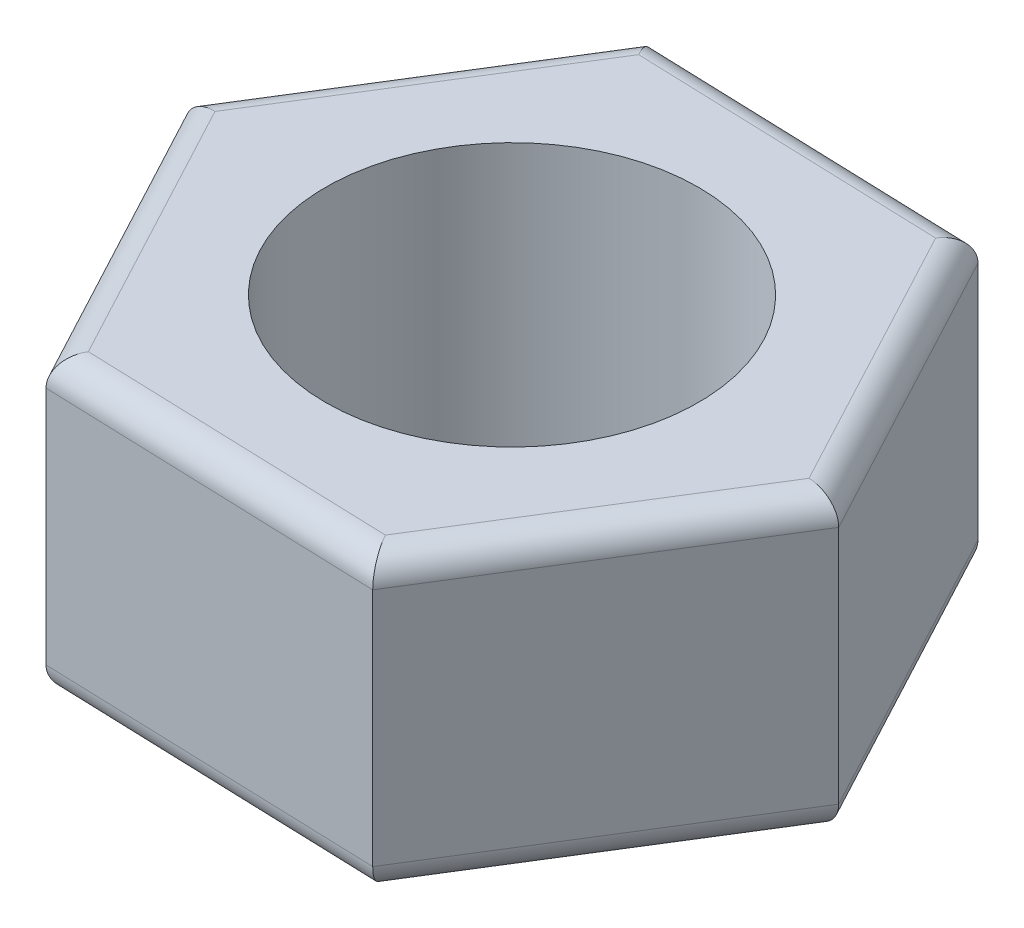
ISO-10303-21;
HEADER;
FILE_DESCRIPTION(('STEP AP214'),'2;1');
FILE_NAME('part.step','',(''),(''),'','','');
FILE_SCHEMA(('AUTOMOTIVE_DESIGN { 1 0 10303 214 1 1 1 1 }'));
ENDSEC;
DATA;
#1=APPLICATION_CONTEXT('core data for automotive mechanical design processes');
#2=APPLICATION_PROTOCOL_DEFINITION('international standard','automotive_design',2000,#1);
#3=PRODUCT_CONTEXT('',#1,'mechanical');
#4=PRODUCT('Part','Part','',(#3));
#5=PRODUCT_RELATED_PRODUCT_CATEGORY('part','',(#4));
#6=PRODUCT_DEFINITION_FORMATION('','',#4);
#7=PRODUCT_DEFINITION_CONTEXT('part definition',#1,'design');
#8=PRODUCT_DEFINITION('design','',#6,#7);
#9=PRODUCT_DEFINITION_SHAPE('','',#8);
#10=(LENGTH_UNIT() NAMED_UNIT(*) SI_UNIT(.MILLI.,.METRE.));
#11=(NAMED_UNIT(*) PLANE_ANGLE_UNIT() SI_UNIT($,.RADIAN.));
#12=(NAMED_UNIT(*) SI_UNIT($,.STERADIAN.) SOLID_ANGLE_UNIT());
#13=UNCERTAINTY_MEASURE_WITH_UNIT(LENGTH_MEASURE(1.E-05),#10,'distance_accuracy_value','');
#14=(GEOMETRIC_REPRESENTATION_CONTEXT(3) GLOBAL_UNCERTAINTY_ASSIGNED_CONTEXT((#13)) GLOBAL_UNIT_ASSIGNED_CONTEXT((#10,
#11,#12)) REPRESENTATION_CONTEXT('',''));
#15=CARTESIAN_POINT('',(0.,0.,0.));
#16=DIRECTION('',(0.,0.,1.));
#17=DIRECTION('',(1.,0.,0.));
#18=AXIS2_PLACEMENT_3D('',#15,#16,#17);
#19=CARTESIAN_POINT('',(0.,11.,0.));
#20=DIRECTION('',(0.,1.,0.));
#21=DIRECTION('',(0.,0.,1.));
#22=AXIS2_PLACEMENT_3D('',#19,#20,#21);
#23=PLANE('',#22);
#24=DIRECTION('',(0.470624118342191,0.,0.882333802613634));
#25=VECTOR('',#24,1.);
#26=CARTESIAN_POINT('',(-5.8344734506044,11.,10.3098134264169));
#27=LINE('',#26,#25);
#28=CARTESIAN_POINT('',(-11.5404876402563,11.,-0.387915401118973));
#29=VERTEX_POINT('',#28);
#30=CARTESIAN_POINT('',(-6.10618841201639,11.,9.80039776796278));
#31=VERTEX_POINT('',#30);
#32=EDGE_CURVE('E197',#29,#31,#27,.T.);
#33=ORIENTED_EDGE('',*,*,#32,.T.);
#34=DIRECTION('',(0.999435546852227,0.,0.0335944591888256));
#35=VECTOR('',#34,1.);
#36=CARTESIAN_POINT('',(6.0113236102527,11.,10.2077089391377));
#37=LINE('',#36,#35);
#38=CARTESIAN_POINT('',(5.43429922823988,11.,10.1883131690818));
#39=VERTEX_POINT('',#38);
#40=EDGE_CURVE('E11',#31,#39,#37,.T.);
#41=ORIENTED_EDGE('',*,*,#40,.T.);
#42=DIRECTION('',(0.528811428510036,0.,-0.848739343424808));
#43=VECTOR('',#42,1.);
#44=CARTESIAN_POINT('',(11.8457970608571,11.,-0.102104487279179));
#45=LINE('',#44,#43);
#46=CARTESIAN_POINT('',(11.5404876402563,11.,0.38791540111896));
#47=VERTEX_POINT('',#46);
#48=EDGE_CURVE('E43',#39,#47,#45,.T.);
#49=ORIENTED_EDGE('',*,*,#48,.T.);
#50=DIRECTION('',(-0.470624118342192,0.,-0.882333802613634));
#51=VECTOR('',#50,1.);
#52=CARTESIAN_POINT('',(5.8344734506044,11.,-10.3098134264169));
#53=LINE('',#52,#51);
#54=CARTESIAN_POINT('',(6.10618841201639,11.,-9.80039776796279));
#55=VERTEX_POINT('',#54);
#56=EDGE_CURVE('E153',#47,#55,#53,.T.);
#57=ORIENTED_EDGE('',*,*,#56,.T.);
#58=DIRECTION('',(-0.999435546852227,0.,-0.0335944591888255));
#59=VECTOR('',#58,1.);
#60=CARTESIAN_POINT('',(-6.0113236102527,11.,-10.2077089391377));
#61=LINE('',#60,#59);
#62=CARTESIAN_POINT('',(-5.43429922823988,11.,-10.1883131690818));
#63=VERTEX_POINT('',#62);
#64=EDGE_CURVE('E201',#55,#63,#61,.T.);
#65=ORIENTED_EDGE('',*,*,#64,.T.);
#66=DIRECTION('',(-0.528811428510036,0.,0.848739343424809));
#67=VECTOR('',#66,1.);
#68=CARTESIAN_POINT('',(-11.8457970608571,11.,0.102104487279166));
#69=LINE('',#68,#67);
#70=EDGE_CURVE('E199',#63,#29,#69,.T.);
#71=ORIENTED_EDGE('',*,*,#70,.T.);
#72=EDGE_LOOP('',(#33,#41,#49,#57,#65,#71));
#73=FACE_BOUND('',#72,.T.);
#74=CARTESIAN_POINT('',(0.,11.,0.));
#75=DIRECTION('',(0.,1.,0.));
#76=DIRECTION('',(0.,0.,1.));
#77=AXIS2_PLACEMENT_3D('',#74,#75,#76);
#78=CIRCLE('',#77,7.);
#79=CARTESIAN_POINT('',(0.,11.,7.));
#80=VERTEX_POINT('',#79);
#81=EDGE_CURVE('E244',#80,#80,#78,.T.);
#82=ORIENTED_EDGE('',*,*,#81,.F.);
#83=EDGE_LOOP('',(#82));
#84=FACE_BOUND('',#83,.T.);
#85=ADVANCED_FACE('F34',(#73,#84),#23,.T.);
#86=CARTESIAN_POINT('',(0.,0.,0.));
#87=DIRECTION('',(0.,1.,0.));
#88=DIRECTION('',(0.,0.,1.));
#89=AXIS2_PLACEMENT_3D('',#86,#87,#88);
#90=PLANE('',#89);
#91=DIRECTION('',(-0.470624118342192,0.,-0.882333802613634));
#92=VECTOR('',#91,1.);
#93=CARTESIAN_POINT('',(8.82333802613634,0.,-4.70624118342191));
#94=LINE('',#93,#92);
#95=CARTESIAN_POINT('',(6.10618841201639,0.,-9.80039776796279));
#96=VERTEX_POINT('',#95);
#97=CARTESIAN_POINT('',(11.5404876402563,0.,0.38791540111896));
#98=VERTEX_POINT('',#97);
#99=EDGE_CURVE('E175',#96,#98,#94,.F.);
#100=ORIENTED_EDGE('',*,*,#99,.T.);
#101=DIRECTION('',(0.528811428510036,0.,-0.848739343424808));
#102=VECTOR('',#101,1.);
#103=CARTESIAN_POINT('',(8.48739343424808,0.,5.28811428510036));
#104=LINE('',#103,#102);
#105=CARTESIAN_POINT('',(5.43429922823988,0.,10.1883131690817));
#106=VERTEX_POINT('',#105);
#107=EDGE_CURVE('E137',#98,#106,#104,.F.);
#108=ORIENTED_EDGE('',*,*,#107,.T.);
#109=DIRECTION('',(0.999435546852227,0.,0.0335944591888256));
#110=VECTOR('',#109,1.);
#111=CARTESIAN_POINT('',(-0.335944591888255,0.,9.99435546852227));
#112=LINE('',#111,#110);
#113=CARTESIAN_POINT('',(-6.10618841201639,0.,9.80039776796278));
#114=VERTEX_POINT('',#113);
#115=EDGE_CURVE('E161',#106,#114,#112,.F.);
#116=ORIENTED_EDGE('',*,*,#115,.T.);
#117=DIRECTION('',(0.470624118342191,0.,0.882333802613634));
#118=VECTOR('',#117,1.);
#119=CARTESIAN_POINT('',(-8.82333802613633,0.,4.70624118342191));
#120=LINE('',#119,#118);
#121=CARTESIAN_POINT('',(-11.5404876402563,0.,-0.387915401118971));
#122=VERTEX_POINT('',#121);
#123=EDGE_CURVE('E169',#114,#122,#120,.F.);
#124=ORIENTED_EDGE('',*,*,#123,.T.);
#125=DIRECTION('',(-0.528811428510036,0.,0.848739343424809));
#126=VECTOR('',#125,1.);
#127=CARTESIAN_POINT('',(-8.48739343424809,0.,-5.28811428510036));
#128=LINE('',#127,#126);
#129=CARTESIAN_POINT('',(-5.43429922823988,0.,-10.1883131690818));
#130=VERTEX_POINT('',#129);
#131=EDGE_CURVE('E171',#122,#130,#128,.F.);
#132=ORIENTED_EDGE('',*,*,#131,.T.);
#133=DIRECTION('',(-0.999435546852227,0.,-0.0335944591888255));
#134=VECTOR('',#133,1.);
#135=CARTESIAN_POINT('',(0.335944591888256,0.,-9.99435546852228));
#136=LINE('',#135,#134);
#137=EDGE_CURVE('E173',#130,#96,#136,.F.);
#138=ORIENTED_EDGE('',*,*,#137,.T.);
#139=EDGE_LOOP('',(#100,#108,#116,#124,#132,#138));
#140=FACE_BOUND('',#139,.T.);
#141=CARTESIAN_POINT('',(0.,0.,0.));
#142=DIRECTION('',(0.,1.,0.));
#143=DIRECTION('',(0.,0.,1.));
#144=AXIS2_PLACEMENT_3D('',#141,#142,#143);
#145=CIRCLE('',#144,7.);
#146=CARTESIAN_POINT('',(0.,0.,7.));
#147=VERTEX_POINT('',#146);
#148=EDGE_CURVE('E221',#147,#147,#145,.T.);
#149=ORIENTED_EDGE('',*,*,#148,.T.);
#150=EDGE_LOOP('',(#149));
#151=FACE_BOUND('',#150,.T.);
#152=ADVANCED_FACE('F301',(#140,#151),#90,.F.);
#153=CARTESIAN_POINT('',(-5.97772915106387,11.,-11.2071444859899));
#154=DIRECTION('',(0.848739343424809,0.,0.528811428510036));
#155=DIRECTION('',(0.528811428510036,0.,-0.848739343424809));
#156=AXIS2_PLACEMENT_3D('',#153,#154,#155);
#157=PLANE('',#156);
#158=DIRECTION('',(0.,-1.,0.));
#159=VECTOR('',#158,1.);
#160=CARTESIAN_POINT('',(-5.97772915106387,11.,-11.2071444859899));
#161=LINE('',#160,#159);
#162=CARTESIAN_POINT('',(-5.97772915106387,10.,-11.2071444859899));
#163=VERTEX_POINT('',#162);
#164=CARTESIAN_POINT('',(-5.97772915106387,1.,-11.2071444859899));
#165=VERTEX_POINT('',#164);
#166=EDGE_CURVE('E241',#163,#165,#161,.T.);
#167=ORIENTED_EDGE('',*,*,#166,.T.);
#168=DIRECTION('',(-0.528811428510036,0.,0.848739343424809));
#169=VECTOR('',#168,1.);
#170=CARTESIAN_POINT('',(-5.97772915106387,1.,-11.2071444859899));
#171=LINE('',#170,#169);
#172=CARTESIAN_POINT('',(-12.6945364042819,1.,-0.426706941230868));
#173=VERTEX_POINT('',#172);
#174=EDGE_CURVE('E186',#165,#173,#171,.T.);
#175=ORIENTED_EDGE('',*,*,#174,.T.);
#176=DIRECTION('',(0.,-1.,0.));
#177=VECTOR('',#176,1.);
#178=CARTESIAN_POINT('',(-12.6945364042819,11.,-0.426706941230868));
#179=LINE('',#178,#177);
#180=CARTESIAN_POINT('',(-12.6945364042819,10.,-0.426706941230868));
#181=VERTEX_POINT('',#180);
#182=EDGE_CURVE('E159',#181,#173,#179,.T.);
#183=ORIENTED_EDGE('',*,*,#182,.F.);
#184=DIRECTION('',(-0.528811428510036,0.,0.848739343424809));
#185=VECTOR('',#184,1.);
#186=CARTESIAN_POINT('',(-5.97772915106387,10.,-11.2071444859899));
#187=LINE('',#186,#185);
#188=EDGE_CURVE('E184',#181,#163,#187,.F.);
#189=ORIENTED_EDGE('',*,*,#188,.T.);
#190=EDGE_LOOP('',(#167,#175,#183,#189));
#191=FACE_BOUND('',#190,.T.);
#192=ADVANCED_FACE('F284',(#191),#157,.F.);
#193=CARTESIAN_POINT('',(-12.6945364042819,11.,-0.426706941230868));
#194=DIRECTION('',(0.882333802613634,0.,-0.470624118342191));
#195=DIRECTION('',(-0.470624118342191,0.,-0.882333802613634));
#196=AXIS2_PLACEMENT_3D('',#193,#194,#195);
#197=PLANE('',#196);
#198=ORIENTED_EDGE('',*,*,#182,.T.);
#199=DIRECTION('',(0.470624118342191,0.,0.882333802613634));
#200=VECTOR('',#199,1.);
#201=CARTESIAN_POINT('',(-12.6945364042819,1.,-0.426706941230868));
#202=LINE('',#201,#200);
#203=CARTESIAN_POINT('',(-6.71680725321803,1.,10.7804375447591));
#204=VERTEX_POINT('',#203);
#205=EDGE_CURVE('E190',#173,#204,#202,.T.);
#206=ORIENTED_EDGE('',*,*,#205,.T.);
#207=DIRECTION('',(0.,-1.,0.));
#208=VECTOR('',#207,1.);
#209=CARTESIAN_POINT('',(-6.71680725321803,11.,10.7804375447591));
#210=LINE('',#209,#208);
#211=CARTESIAN_POINT('',(-6.71680725321803,10.,10.7804375447591));
#212=VERTEX_POINT('',#211);
#213=EDGE_CURVE('E164',#212,#204,#210,.T.);
#214=ORIENTED_EDGE('',*,*,#213,.F.);
#215=DIRECTION('',(0.470624118342191,0.,0.882333802613634));
#216=VECTOR('',#215,1.);
#217=CARTESIAN_POINT('',(-12.6945364042819,10.,-0.426706941230869));
#218=LINE('',#217,#216);
#219=EDGE_CURVE('E188',#212,#181,#218,.F.);
#220=ORIENTED_EDGE('',*,*,#219,.T.);
#221=EDGE_LOOP('',(#198,#206,#214,#220));
#222=FACE_BOUND('',#221,.T.);
#223=ADVANCED_FACE('F285',(#222),#197,.F.);
#224=CARTESIAN_POINT('',(-6.71680725321803,11.,10.7804375447591));
#225=DIRECTION('',(0.0335944591888256,0.,-0.999435546852227));
#226=DIRECTION('',(-0.999435546852227,0.,-0.0335944591888256));
#227=AXIS2_PLACEMENT_3D('',#224,#225,#226);
#228=PLANE('',#227);
#229=ORIENTED_EDGE('',*,*,#213,.T.);
#230=DIRECTION('',(0.999435546852227,0.,0.0335944591888256));
#231=VECTOR('',#230,1.);
#232=CARTESIAN_POINT('',(-6.71680725321803,1.,10.7804375447591));
#233=LINE('',#232,#231);
#234=CARTESIAN_POINT('',(5.97772915106387,1.,11.2071444859899));
#235=VERTEX_POINT('',#234);
#236=EDGE_CURVE('E195',#204,#235,#233,.T.);
#237=ORIENTED_EDGE('',*,*,#236,.T.);
#238=DIRECTION('',(0.,-1.,0.));
#239=VECTOR('',#238,1.);
#240=CARTESIAN_POINT('',(5.97772915106387,11.,11.2071444859899));
#241=LINE('',#240,#239);
#242=CARTESIAN_POINT('',(5.97772915106387,10.,11.2071444859899));
#243=VERTEX_POINT('',#242);
#244=EDGE_CURVE('E148',#243,#235,#241,.T.);
#245=ORIENTED_EDGE('',*,*,#244,.F.);
#246=DIRECTION('',(0.999435546852227,0.,0.0335944591888256));
#247=VECTOR('',#246,1.);
#248=CARTESIAN_POINT('',(-6.71680725321803,10.,10.7804375447591));
#249=LINE('',#248,#247);
#250=EDGE_CURVE('E192',#243,#212,#249,.F.);
#251=ORIENTED_EDGE('',*,*,#250,.T.);
#252=EDGE_LOOP('',(#229,#237,#245,#251));
#253=FACE_BOUND('',#252,.T.);
#254=ADVANCED_FACE('F255',(#253),#228,.F.);
#255=CARTESIAN_POINT('',(5.97772915106387,11.,11.2071444859899));
#256=DIRECTION('',(-0.848739343424809,0.,-0.528811428510036));
#257=DIRECTION('',(-0.528811428510036,0.,0.848739343424808));
#258=AXIS2_PLACEMENT_3D('',#255,#256,#257);
#259=PLANE('',#258);
#260=ORIENTED_EDGE('',*,*,#244,.T.);
#261=DIRECTION('',(0.528811428510036,0.,-0.848739343424808));
#262=VECTOR('',#261,1.);
#263=CARTESIAN_POINT('',(5.97772915106387,1.,11.2071444859899));
#264=LINE('',#263,#262);
#265=CARTESIAN_POINT('',(12.6945364042819,1.,0.426706941230856));
#266=VERTEX_POINT('',#265);
#267=EDGE_CURVE('E147',#235,#266,#264,.T.);
#268=ORIENTED_EDGE('',*,*,#267,.T.);
#269=DIRECTION('',(0.,-1.,0.));
#270=VECTOR('',#269,1.);
#271=CARTESIAN_POINT('',(12.6945364042819,11.,0.426706941230856));
#272=LINE('',#271,#270);
#273=CARTESIAN_POINT('',(12.6945364042819,10.,0.426706941230856));
#274=VERTEX_POINT('',#273);
#275=EDGE_CURVE('E129',#274,#266,#272,.T.);
#276=ORIENTED_EDGE('',*,*,#275,.F.);
#277=DIRECTION('',(0.528811428510036,0.,-0.848739343424808));
#278=VECTOR('',#277,1.);
#279=CARTESIAN_POINT('',(5.97772915106387,10.,11.2071444859899));
#280=LINE('',#279,#278);
#281=EDGE_CURVE('E144',#274,#243,#280,.F.);
#282=ORIENTED_EDGE('',*,*,#281,.T.);
#283=EDGE_LOOP('',(#260,#268,#276,#282));
#284=FACE_BOUND('',#283,.T.);
#285=ADVANCED_FACE('F142',(#284),#259,.F.);
#286=CARTESIAN_POINT('',(12.6945364042819,11.,0.426706941230856));
#287=DIRECTION('',(-0.882333802613634,0.,0.470624118342192));
#288=DIRECTION('',(0.470624118342192,0.,0.882333802613634));
#289=AXIS2_PLACEMENT_3D('',#286,#287,#288);
#290=PLANE('',#289);
#291=ORIENTED_EDGE('',*,*,#275,.T.);
#292=DIRECTION('',(-0.470624118342192,0.,-0.882333802613634));
#293=VECTOR('',#292,1.);
#294=CARTESIAN_POINT('',(12.6945364042819,1.,0.426706941230856));
#295=LINE('',#294,#293);
#296=CARTESIAN_POINT('',(6.71680725321803,1.,-10.7804375447591));
#297=VERTEX_POINT('',#296);
#298=EDGE_CURVE('E136',#266,#297,#295,.T.);
#299=ORIENTED_EDGE('',*,*,#298,.T.);
#300=DIRECTION('',(0.,-1.,0.));
#301=VECTOR('',#300,1.);
#302=CARTESIAN_POINT('',(6.71680725321803,11.,-10.7804375447591));
#303=LINE('',#302,#301);
#304=CARTESIAN_POINT('',(6.71680725321803,10.,-10.7804375447591));
#305=VERTEX_POINT('',#304);
#306=EDGE_CURVE('E131',#305,#297,#303,.T.);
#307=ORIENTED_EDGE('',*,*,#306,.F.);
#308=DIRECTION('',(-0.470624118342192,0.,-0.882333802613634));
#309=VECTOR('',#308,1.);
#310=CARTESIAN_POINT('',(12.6945364042819,10.,0.426706941230858));
#311=LINE('',#310,#309);
#312=EDGE_CURVE('E126',#305,#274,#311,.F.);
#313=ORIENTED_EDGE('',*,*,#312,.T.);
#314=EDGE_LOOP('',(#291,#299,#307,#313));
#315=FACE_BOUND('',#314,.T.);
#316=ADVANCED_FACE('F128',(#315),#290,.F.);
#317=CARTESIAN_POINT('',(6.71680725321803,11.,-10.7804375447591));
#318=DIRECTION('',(-0.0335944591888255,0.,0.999435546852227));
#319=DIRECTION('',(0.999435546852227,0.,0.0335944591888255));
#320=AXIS2_PLACEMENT_3D('',#317,#318,#319);
#321=PLANE('',#320);
#322=ORIENTED_EDGE('',*,*,#306,.T.);
#323=DIRECTION('',(-0.999435546852227,0.,-0.0335944591888255));
#324=VECTOR('',#323,1.);
#325=CARTESIAN_POINT('',(6.71680725321803,1.,-10.7804375447591));
#326=LINE('',#325,#324);
#327=EDGE_CURVE('E182',#297,#165,#326,.T.);
#328=ORIENTED_EDGE('',*,*,#327,.T.);
#329=ORIENTED_EDGE('',*,*,#166,.F.);
#330=DIRECTION('',(-0.999435546852227,0.,-0.0335944591888255));
#331=VECTOR('',#330,1.);
#332=CARTESIAN_POINT('',(6.71680725321803,10.,-10.7804375447591));
#333=LINE('',#332,#331);
#334=EDGE_CURVE('E180',#163,#305,#333,.F.);
#335=ORIENTED_EDGE('',*,*,#334,.T.);
#336=EDGE_LOOP('',(#322,#328,#329,#335));
#337=FACE_BOUND('',#336,.T.);
#338=ADVANCED_FACE('F238',(#337),#321,.F.);
#339=CARTESIAN_POINT('',(0.,11.,0.));
#340=DIRECTION('',(0.,-1.,0.));
#341=DIRECTION('',(0.,0.,-1.));
#342=AXIS2_PLACEMENT_3D('',#339,#340,#341);
#343=CYLINDRICAL_SURFACE('',#342,7.);
#344=ORIENTED_EDGE('',*,*,#81,.T.);
#345=EDGE_LOOP('',(#344));
#346=FACE_BOUND('',#345,.T.);
#347=ORIENTED_EDGE('',*,*,#148,.F.);
#348=EDGE_LOOP('',(#347));
#349=FACE_BOUND('',#348,.T.);
#350=ADVANCED_FACE('F309',(#346,#349),#343,.F.);
#351=CARTESIAN_POINT('',(-5.12898980763907,1.,-10.6783330574799));
#352=DIRECTION('',(-0.528811428510036,0.,0.848739343424809));
#353=DIRECTION('',(0.848739343424809,0.,0.528811428510036));
#354=AXIS2_PLACEMENT_3D('',#351,#352,#353);
#355=CYLINDRICAL_SURFACE('',#354,1.);
#356=CARTESIAN_POINT('',(-5.43429922823989,1.,-10.1883131690818));
#357=DIRECTION('',(-0.882333802613634,0.,0.470624118342191));
#358=DIRECTION('',(0.470624118342191,0.,0.882333802613634));
#359=AXIS2_PLACEMENT_3D('',#356,#357,#358);
#360=ELLIPSE('',#359,1.15470053837925,1.);
#361=EDGE_CURVE('E215',#130,#165,#360,.F.);
#362=ORIENTED_EDGE('',*,*,#361,.F.);
#363=ORIENTED_EDGE('',*,*,#131,.F.);
#364=CARTESIAN_POINT('',(-11.5404876402563,1.,-0.387915401118973));
#365=DIRECTION('',(-0.0335944591888254,0.,0.999435546852227));
#366=DIRECTION('',(0.999435546852227,0.,0.0335944591888254));
#367=AXIS2_PLACEMENT_3D('',#364,#365,#366);
#368=ELLIPSE('',#367,1.15470053837925,1.);
#369=EDGE_CURVE('E218',#173,#122,#368,.T.);
#370=ORIENTED_EDGE('',*,*,#369,.F.);
#371=ORIENTED_EDGE('',*,*,#174,.F.);
#372=EDGE_LOOP('',(#362,#363,#370,#371));
#373=FACE_BOUND('',#372,.T.);
#374=ADVANCED_FACE('F281',(#373),#355,.T.);
#375=CARTESIAN_POINT('',(-11.8122026016683,1.,-0.897331059573059));
#376=DIRECTION('',(0.470624118342191,0.,0.882333802613634));
#377=DIRECTION('',(0.882333802613634,0.,-0.470624118342191));
#378=AXIS2_PLACEMENT_3D('',#375,#376,#377);
#379=CYLINDRICAL_SURFACE('',#378,1.);
#380=ORIENTED_EDGE('',*,*,#369,.T.);
#381=ORIENTED_EDGE('',*,*,#123,.F.);
#382=CARTESIAN_POINT('',(-6.10618841201639,1.,9.80039776796278));
#383=DIRECTION('',(0.848739343424808,0.,0.528811428510036));
#384=DIRECTION('',(0.528811428510036,0.,-0.848739343424809));
#385=AXIS2_PLACEMENT_3D('',#382,#383,#384);
#386=ELLIPSE('',#385,1.15470053837925,1.);
#387=EDGE_CURVE('E212',#204,#114,#386,.T.);
#388=ORIENTED_EDGE('',*,*,#387,.F.);
#389=ORIENTED_EDGE('',*,*,#205,.F.);
#390=EDGE_LOOP('',(#380,#381,#388,#389));
#391=FACE_BOUND('',#390,.T.);
#392=ADVANCED_FACE('F261',(#391),#379,.T.);
#393=CARTESIAN_POINT('',(6.68321279402921,1.,-9.78100199790684));
#394=DIRECTION('',(-0.999435546852227,0.,-0.0335944591888255));
#395=DIRECTION('',(-0.0335944591888255,0.,0.999435546852227));
#396=AXIS2_PLACEMENT_3D('',#393,#394,#395);
#397=CYLINDRICAL_SURFACE('',#396,1.);
#398=ORIENTED_EDGE('',*,*,#361,.T.);
#399=ORIENTED_EDGE('',*,*,#327,.F.);
#400=CARTESIAN_POINT('',(6.10618841201639,1.,-9.80039776796279));
#401=DIRECTION('',(-0.848739343424809,0.,-0.528811428510036));
#402=DIRECTION('',(-0.528811428510036,0.,0.848739343424809));
#403=AXIS2_PLACEMENT_3D('',#400,#401,#402);
#404=ELLIPSE('',#403,1.15470053837925,1.);
#405=EDGE_CURVE('E209',#96,#297,#404,.F.);
#406=ORIENTED_EDGE('',*,*,#405,.F.);
#407=ORIENTED_EDGE('',*,*,#137,.F.);
#408=EDGE_LOOP('',(#398,#399,#406,#407));
#409=FACE_BOUND('',#408,.T.);
#410=ADVANCED_FACE('F277',(#409),#397,.T.);
#411=CARTESIAN_POINT('',(-6.68321279402921,1.,9.78100199790683));
#412=DIRECTION('',(0.999435546852227,0.,0.0335944591888256));
#413=DIRECTION('',(0.0335944591888256,0.,-0.999435546852227));
#414=AXIS2_PLACEMENT_3D('',#411,#412,#413);
#415=CYLINDRICAL_SURFACE('',#414,1.);
#416=ORIENTED_EDGE('',*,*,#387,.T.);
#417=ORIENTED_EDGE('',*,*,#115,.F.);
#418=CARTESIAN_POINT('',(5.43429922823988,1.,10.1883131690817));
#419=DIRECTION('',(0.882333802613634,0.,-0.470624118342191));
#420=DIRECTION('',(0.470624118342191,0.,0.882333802613634));
#421=AXIS2_PLACEMENT_3D('',#418,#419,#420);
#422=ELLIPSE('',#421,1.15470053837925,1.);
#423=EDGE_CURVE('E207',#235,#106,#422,.T.);
#424=ORIENTED_EDGE('',*,*,#423,.F.);
#425=ORIENTED_EDGE('',*,*,#236,.F.);
#426=EDGE_LOOP('',(#416,#417,#424,#425));
#427=FACE_BOUND('',#426,.T.);
#428=ADVANCED_FACE('F265',(#427),#415,.T.);
#429=CARTESIAN_POINT('',(11.8122026016683,1.,0.897331059573048));
#430=DIRECTION('',(-0.470624118342192,0.,-0.882333802613634));
#431=DIRECTION('',(-0.882333802613634,0.,0.470624118342192));
#432=AXIS2_PLACEMENT_3D('',#429,#430,#431);
#433=CYLINDRICAL_SURFACE('',#432,1.);
#434=ORIENTED_EDGE('',*,*,#405,.T.);
#435=ORIENTED_EDGE('',*,*,#298,.F.);
#436=CARTESIAN_POINT('',(11.5404876402563,1.,0.387915401118962));
#437=DIRECTION('',(0.0335944591888254,0.,-0.999435546852227));
#438=DIRECTION('',(-0.999435546852227,0.,-0.0335944591888256));
#439=AXIS2_PLACEMENT_3D('',#436,#437,#438);
#440=ELLIPSE('',#439,1.15470053837925,1.);
#441=EDGE_CURVE('E205',#98,#266,#440,.F.);
#442=ORIENTED_EDGE('',*,*,#441,.F.);
#443=ORIENTED_EDGE('',*,*,#99,.F.);
#444=EDGE_LOOP('',(#434,#435,#442,#443));
#445=FACE_BOUND('',#444,.T.);
#446=ADVANCED_FACE('F273',(#445),#433,.T.);
#447=CARTESIAN_POINT('',(5.12898980763906,1.,10.6783330574799));
#448=DIRECTION('',(0.528811428510036,0.,-0.848739343424808));
#449=DIRECTION('',(-0.848739343424809,0.,-0.528811428510036));
#450=AXIS2_PLACEMENT_3D('',#447,#448,#449);
#451=CYLINDRICAL_SURFACE('',#450,1.);
#452=ORIENTED_EDGE('',*,*,#423,.T.);
#453=ORIENTED_EDGE('',*,*,#107,.F.);
#454=ORIENTED_EDGE('',*,*,#441,.T.);
#455=ORIENTED_EDGE('',*,*,#267,.F.);
#456=EDGE_LOOP('',(#452,#453,#454,#455));
#457=FACE_BOUND('',#456,.T.);
#458=ADVANCED_FACE('F268',(#457),#451,.T.);
#459=CARTESIAN_POINT('',(0.335944591888256,10.,-9.99435546852228));
#460=DIRECTION('',(0.999435546852227,0.,0.0335944591888255));
#461=DIRECTION('',(0.0335944591888255,0.,-0.999435546852227));
#462=AXIS2_PLACEMENT_3D('',#459,#460,#461);
#463=CYLINDRICAL_SURFACE('',#462,1.);
#464=CARTESIAN_POINT('',(6.10618841201639,10.,-9.80039776796279));
#465=DIRECTION('',(0.848739343424809,0.,0.528811428510036));
#466=DIRECTION('',(0.528811428510036,0.,-0.848739343424809));
#467=AXIS2_PLACEMENT_3D('',#464,#465,#466);
#468=ELLIPSE('',#467,1.15470053837925,1.);
#469=EDGE_CURVE('E225',#305,#55,#468,.T.);
#470=ORIENTED_EDGE('',*,*,#469,.F.);
#471=ORIENTED_EDGE('',*,*,#334,.F.);
#472=CARTESIAN_POINT('',(-5.43429922823989,10.,-10.1883131690818));
#473=DIRECTION('',(0.882333802613634,0.,-0.470624118342191));
#474=DIRECTION('',(-0.470624118342191,0.,-0.882333802613634));
#475=AXIS2_PLACEMENT_3D('',#472,#473,#474);
#476=ELLIPSE('',#475,1.15470053837925,1.);
#477=EDGE_CURVE('E38',#63,#163,#476,.F.);
#478=ORIENTED_EDGE('',*,*,#477,.F.);
#479=ORIENTED_EDGE('',*,*,#64,.F.);
#480=EDGE_LOOP('',(#470,#471,#478,#479));
#481=FACE_BOUND('',#480,.T.);
#482=ADVANCED_FACE('F36',(#481),#463,.T.);
#483=CARTESIAN_POINT('',(-8.48739343424809,10.,-5.28811428510036));
#484=DIRECTION('',(0.528811428510036,0.,-0.848739343424809));
#485=DIRECTION('',(-0.848739343424809,0.,-0.528811428510036));
#486=AXIS2_PLACEMENT_3D('',#483,#484,#485);
#487=CYLINDRICAL_SURFACE('',#486,1.);
#488=ORIENTED_EDGE('',*,*,#477,.T.);
#489=ORIENTED_EDGE('',*,*,#188,.F.);
#490=CARTESIAN_POINT('',(-11.5404876402563,10.,-0.387915401118973));
#491=DIRECTION('',(0.0335944591888254,0.,-0.999435546852227));
#492=DIRECTION('',(-0.999435546852227,0.,-0.0335944591888254));
#493=AXIS2_PLACEMENT_3D('',#490,#491,#492);
#494=ELLIPSE('',#493,1.15470053837925,1.);
#495=EDGE_CURVE('E155',#29,#181,#494,.F.);
#496=ORIENTED_EDGE('',*,*,#495,.F.);
#497=ORIENTED_EDGE('',*,*,#70,.F.);
#498=EDGE_LOOP('',(#488,#489,#496,#497));
#499=FACE_BOUND('',#498,.T.);
#500=ADVANCED_FACE('F231',(#499),#487,.T.);
#501=CARTESIAN_POINT('',(8.82333802613634,10.,-4.70624118342191));
#502=DIRECTION('',(0.470624118342192,0.,0.882333802613634));
#503=DIRECTION('',(0.882333802613634,0.,-0.470624118342192));
#504=AXIS2_PLACEMENT_3D('',#501,#502,#503);
#505=CYLINDRICAL_SURFACE('',#504,1.);
#506=ORIENTED_EDGE('',*,*,#469,.T.);
#507=ORIENTED_EDGE('',*,*,#56,.F.);
#508=CARTESIAN_POINT('',(11.5404876402563,10.,0.387915401118962));
#509=DIRECTION('',(-0.0335944591888254,0.,0.999435546852227));
#510=DIRECTION('',(0.999435546852227,0.,0.0335944591888256));
#511=AXIS2_PLACEMENT_3D('',#508,#509,#510);
#512=ELLIPSE('',#511,1.15470053837925,1.);
#513=EDGE_CURVE('E151',#274,#47,#512,.T.);
#514=ORIENTED_EDGE('',*,*,#513,.F.);
#515=ORIENTED_EDGE('',*,*,#312,.F.);
#516=EDGE_LOOP('',(#506,#507,#514,#515));
#517=FACE_BOUND('',#516,.T.);
#518=ADVANCED_FACE('F152',(#517),#505,.T.);
#519=CARTESIAN_POINT('',(-8.82333802613633,10.,4.70624118342191));
#520=DIRECTION('',(-0.470624118342191,0.,-0.882333802613634));
#521=DIRECTION('',(-0.882333802613634,0.,0.470624118342191));
#522=AXIS2_PLACEMENT_3D('',#519,#520,#521);
#523=CYLINDRICAL_SURFACE('',#522,1.);
#524=ORIENTED_EDGE('',*,*,#495,.T.);
#525=ORIENTED_EDGE('',*,*,#219,.F.);
#526=CARTESIAN_POINT('',(-6.10618841201639,10.,9.80039776796278));
#527=DIRECTION('',(-0.848739343424808,0.,-0.528811428510036));
#528=DIRECTION('',(0.528811428510036,0.,-0.848739343424809));
#529=AXIS2_PLACEMENT_3D('',#526,#527,#528);
#530=ELLIPSE('',#529,1.15470053837925,1.);
#531=EDGE_CURVE('E156',#31,#212,#530,.F.);
#532=ORIENTED_EDGE('',*,*,#531,.F.);
#533=ORIENTED_EDGE('',*,*,#32,.F.);
#534=EDGE_LOOP('',(#524,#525,#532,#533));
#535=FACE_BOUND('',#534,.T.);
#536=ADVANCED_FACE('F289',(#535),#523,.T.);
#537=CARTESIAN_POINT('',(8.48739343424808,10.,5.28811428510036));
#538=DIRECTION('',(-0.528811428510036,0.,0.848739343424808));
#539=DIRECTION('',(0.848739343424809,0.,0.528811428510036));
#540=AXIS2_PLACEMENT_3D('',#537,#538,#539);
#541=CYLINDRICAL_SURFACE('',#540,1.);
#542=ORIENTED_EDGE('',*,*,#513,.T.);
#543=ORIENTED_EDGE('',*,*,#48,.F.);
#544=CARTESIAN_POINT('',(5.43429922823988,10.,10.1883131690818));
#545=DIRECTION('',(-0.882333802613634,0.,0.470624118342191));
#546=DIRECTION('',(0.470624118342191,0.,0.882333802613634));
#547=AXIS2_PLACEMENT_3D('',#544,#545,#546);
#548=ELLIPSE('',#547,1.15470053837925,1.);
#549=EDGE_CURVE('E51',#243,#39,#548,.T.);
#550=ORIENTED_EDGE('',*,*,#549,.F.);
#551=ORIENTED_EDGE('',*,*,#281,.F.);
#552=EDGE_LOOP('',(#542,#543,#550,#551));
#553=FACE_BOUND('',#552,.T.);
#554=ADVANCED_FACE('F158',(#553),#541,.T.);
#555=CARTESIAN_POINT('',(-0.335944591888255,10.,9.99435546852227));
#556=DIRECTION('',(-0.999435546852227,0.,-0.0335944591888256));
#557=DIRECTION('',(-0.0335944591888256,0.,0.999435546852227));
#558=AXIS2_PLACEMENT_3D('',#555,#556,#557);
#559=CYLINDRICAL_SURFACE('',#558,1.);
#560=ORIENTED_EDGE('',*,*,#531,.T.);
#561=ORIENTED_EDGE('',*,*,#250,.F.);
#562=ORIENTED_EDGE('',*,*,#549,.T.);
#563=ORIENTED_EDGE('',*,*,#40,.F.);
#564=EDGE_LOOP('',(#560,#561,#562,#563));
#565=FACE_BOUND('',#564,.T.);
#566=ADVANCED_FACE('F292',(#565),#559,.T.);
#567=CLOSED_SHELL('',(#85,#152,#192,#223,#254,#285,#316,#338,#350,#374,#392,#410,#428,#446,#458,
#482,#500,#518,#536,#554,#566));
#568=MANIFOLD_SOLID_BREP('B2',#567);
#569=ADVANCED_BREP_SHAPE_REPRESENTATION('',(#18,#568),#14);
#570=SHAPE_DEFINITION_REPRESENTATION(#9,#569);
ENDSEC;
END-ISO-10303-21;
